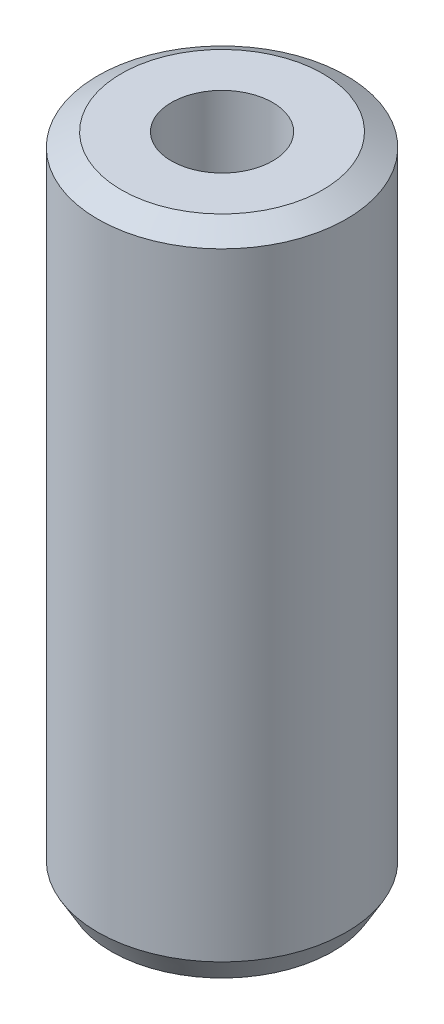
ISO-10303-21;
HEADER;
FILE_DESCRIPTION(('STEP AP214'),'2;1');
FILE_NAME('part.step','',(''),(''),'','','');
FILE_SCHEMA(('AUTOMOTIVE_DESIGN { 1 0 10303 214 1 1 1 1 }'));
ENDSEC;
DATA;
#1=APPLICATION_CONTEXT('core data for automotive mechanical design processes');
#2=APPLICATION_PROTOCOL_DEFINITION('international standard','automotive_design',2000,#1);
#3=PRODUCT_CONTEXT('',#1,'mechanical');
#4=PRODUCT('Part','Part','',(#3));
#5=PRODUCT_RELATED_PRODUCT_CATEGORY('part','',(#4));
#6=PRODUCT_DEFINITION_FORMATION('','',#4);
#7=PRODUCT_DEFINITION_CONTEXT('part definition',#1,'design');
#8=PRODUCT_DEFINITION('design','',#6,#7);
#9=PRODUCT_DEFINITION_SHAPE('','',#8);
#10=(LENGTH_UNIT() NAMED_UNIT(*) SI_UNIT(.MILLI.,.METRE.));
#11=(NAMED_UNIT(*) PLANE_ANGLE_UNIT() SI_UNIT($,.RADIAN.));
#12=(NAMED_UNIT(*) SI_UNIT($,.STERADIAN.) SOLID_ANGLE_UNIT());
#13=UNCERTAINTY_MEASURE_WITH_UNIT(LENGTH_MEASURE(1.E-05),#10,'distance_accuracy_value','');
#14=(GEOMETRIC_REPRESENTATION_CONTEXT(3) GLOBAL_UNCERTAINTY_ASSIGNED_CONTEXT((#13)) GLOBAL_UNIT_ASSIGNED_CONTEXT((#10,
#11,#12)) REPRESENTATION_CONTEXT('',''));
#15=CARTESIAN_POINT('',(0.,0.,0.));
#16=DIRECTION('',(0.,0.,1.));
#17=DIRECTION('',(1.,0.,0.));
#18=AXIS2_PLACEMENT_3D('',#15,#16,#17);
#19=CARTESIAN_POINT('',(0.,184.357450578019,0.));
#20=DIRECTION('',(0.,-1.,0.));
#21=DIRECTION('',(0.,0.,-1.));
#22=AXIS2_PLACEMENT_3D('',#19,#20,#21);
#23=CYLINDRICAL_SURFACE('',#22,35.);
#24=CARTESIAN_POINT('',(0.,180.530577095334,0.));
#25=DIRECTION('',(0.,1.,0.));
#26=DIRECTION('',(0.,0.,1.));
#27=AXIS2_PLACEMENT_3D('',#24,#25,#26);
#28=CIRCLE('',#27,35.);
#29=CARTESIAN_POINT('',(0.,180.530577095334,35.));
#30=VERTEX_POINT('',#29);
#31=EDGE_CURVE('E50',#30,#30,#28,.F.);
#32=ORIENTED_EDGE('',*,*,#31,.T.);
#33=EDGE_LOOP('',(#32));
#34=FACE_BOUND('',#33,.T.);
#35=CARTESIAN_POINT('',(0.,6.62833930614887,0.));
#36=DIRECTION('',(0.,1.,0.));
#37=DIRECTION('',(0.,0.,1.));
#38=AXIS2_PLACEMENT_3D('',#35,#36,#37);
#39=CIRCLE('',#38,35.);
#40=CARTESIAN_POINT('',(0.,6.62833930614887,35.));
#41=VERTEX_POINT('',#40);
#42=EDGE_CURVE('E51',#41,#41,#39,.T.);
#43=ORIENTED_EDGE('',*,*,#42,.T.);
#44=EDGE_LOOP('',(#43));
#45=FACE_BOUND('',#44,.T.);
#46=ADVANCED_FACE('F39',(#34,#45),#23,.T.);
#47=CARTESIAN_POINT('',(0.,184.357450578019,0.));
#48=DIRECTION('',(0.,1.,0.));
#49=DIRECTION('',(0.,0.,1.));
#50=AXIS2_PLACEMENT_3D('',#47,#48,#49);
#51=PLANE('',#50);
#52=CARTESIAN_POINT('',(0.,184.357450578019,0.));
#53=DIRECTION('',(0.,1.,0.));
#54=DIRECTION('',(0.,0.,1.));
#55=AXIS2_PLACEMENT_3D('',#52,#53,#54);
#56=CIRCLE('',#55,28.3716606938512);
#57=CARTESIAN_POINT('',(0.,184.357450578019,28.3716606938512));
#58=VERTEX_POINT('',#57);
#59=EDGE_CURVE('E54',#58,#58,#56,.T.);
#60=ORIENTED_EDGE('',*,*,#59,.T.);
#61=EDGE_LOOP('',(#60));
#62=FACE_BOUND('',#61,.T.);
#63=CARTESIAN_POINT('',(0.,184.357450578019,0.));
#64=DIRECTION('',(0.,1.,0.));
#65=DIRECTION('',(0.,0.,1.));
#66=AXIS2_PLACEMENT_3D('',#63,#64,#65);
#67=CIRCLE('',#66,14.2677300394104);
#68=CARTESIAN_POINT('',(0.,184.357450578019,14.2677300394104));
#69=VERTEX_POINT('',#68);
#70=EDGE_CURVE('E58',#69,#69,#67,.T.);
#71=ORIENTED_EDGE('',*,*,#70,.F.);
#72=EDGE_LOOP('',(#71));
#73=FACE_BOUND('',#72,.T.);
#74=ADVANCED_FACE('F69',(#62,#73),#51,.T.);
#75=CARTESIAN_POINT('',(0.,0.,0.));
#76=DIRECTION('',(0.,1.,0.));
#77=DIRECTION('',(0.,0.,1.));
#78=AXIS2_PLACEMENT_3D('',#75,#76,#77);
#79=PLANE('',#78);
#80=CARTESIAN_POINT('',(0.,0.,0.));
#81=DIRECTION('',(0.,1.,0.));
#82=DIRECTION('',(0.,0.,1.));
#83=AXIS2_PLACEMENT_3D('',#80,#81,#82);
#84=CIRCLE('',#83,31.1731265173147);
#85=CARTESIAN_POINT('',(0.,0.,31.1731265173147));
#86=VERTEX_POINT('',#85);
#87=EDGE_CURVE('E10',#86,#86,#84,.F.);
#88=ORIENTED_EDGE('',*,*,#87,.T.);
#89=EDGE_LOOP('',(#88));
#90=FACE_BOUND('',#89,.T.);
#91=CARTESIAN_POINT('',(0.,0.,0.));
#92=DIRECTION('',(0.,1.,0.));
#93=DIRECTION('',(0.,0.,1.));
#94=AXIS2_PLACEMENT_3D('',#91,#92,#93);
#95=CIRCLE('',#94,14.2677300394104);
#96=CARTESIAN_POINT('',(0.,0.,14.2677300394104));
#97=VERTEX_POINT('',#96);
#98=EDGE_CURVE('E63',#97,#97,#95,.T.);
#99=ORIENTED_EDGE('',*,*,#98,.T.);
#100=EDGE_LOOP('',(#99));
#101=FACE_BOUND('',#100,.T.);
#102=ADVANCED_FACE('F75',(#90,#101),#79,.F.);
#103=CARTESIAN_POINT('',(0.,184.357450578019,0.));
#104=DIRECTION('',(0.,-1.,0.));
#105=DIRECTION('',(0.,0.,-1.));
#106=AXIS2_PLACEMENT_3D('',#103,#104,#105);
#107=CYLINDRICAL_SURFACE('',#106,14.2677300394104);
#108=ORIENTED_EDGE('',*,*,#70,.T.);
#109=EDGE_LOOP('',(#108));
#110=FACE_BOUND('',#109,.T.);
#111=ORIENTED_EDGE('',*,*,#98,.F.);
#112=EDGE_LOOP('',(#111));
#113=FACE_BOUND('',#112,.T.);
#114=ADVANCED_FACE('F70',(#110,#113),#107,.F.);
#115=CARTESIAN_POINT('',(0.,184.357450578019,0.));
#116=DIRECTION('',(0.,-1.,0.));
#117=DIRECTION('',(0.,0.,-1.));
#118=AXIS2_PLACEMENT_3D('',#115,#116,#117);
#119=CONICAL_SURFACE('',#118,28.3716606938512,1.04719755119659);
#120=ORIENTED_EDGE('',*,*,#31,.F.);
#121=EDGE_LOOP('',(#120));
#122=FACE_BOUND('',#121,.T.);
#123=ORIENTED_EDGE('',*,*,#59,.F.);
#124=EDGE_LOOP('',(#123));
#125=FACE_BOUND('',#124,.T.);
#126=ADVANCED_FACE('F81',(#122,#125),#119,.T.);
#127=CARTESIAN_POINT('',(0.,6.62833930614887,0.));
#128=DIRECTION('',(0.,1.,0.));
#129=DIRECTION('',(0.,0.,1.));
#130=AXIS2_PLACEMENT_3D('',#127,#128,#129);
#131=CONICAL_SURFACE('',#130,35.,0.523598775598304);
#132=ORIENTED_EDGE('',*,*,#87,.F.);
#133=EDGE_LOOP('',(#132));
#134=FACE_BOUND('',#133,.T.);
#135=ORIENTED_EDGE('',*,*,#42,.F.);
#136=EDGE_LOOP('',(#135));
#137=FACE_BOUND('',#136,.T.);
#138=ADVANCED_FACE('F45',(#134,#137),#131,.T.);
#139=CLOSED_SHELL('',(#46,#74,#102,#114,#126,#138));
#140=MANIFOLD_SOLID_BREP('B2',#139);
#141=ADVANCED_BREP_SHAPE_REPRESENTATION('',(#18,#140),#14);
#142=SHAPE_DEFINITION_REPRESENTATION(#9,#141);
ENDSEC;
END-ISO-10303-21;
